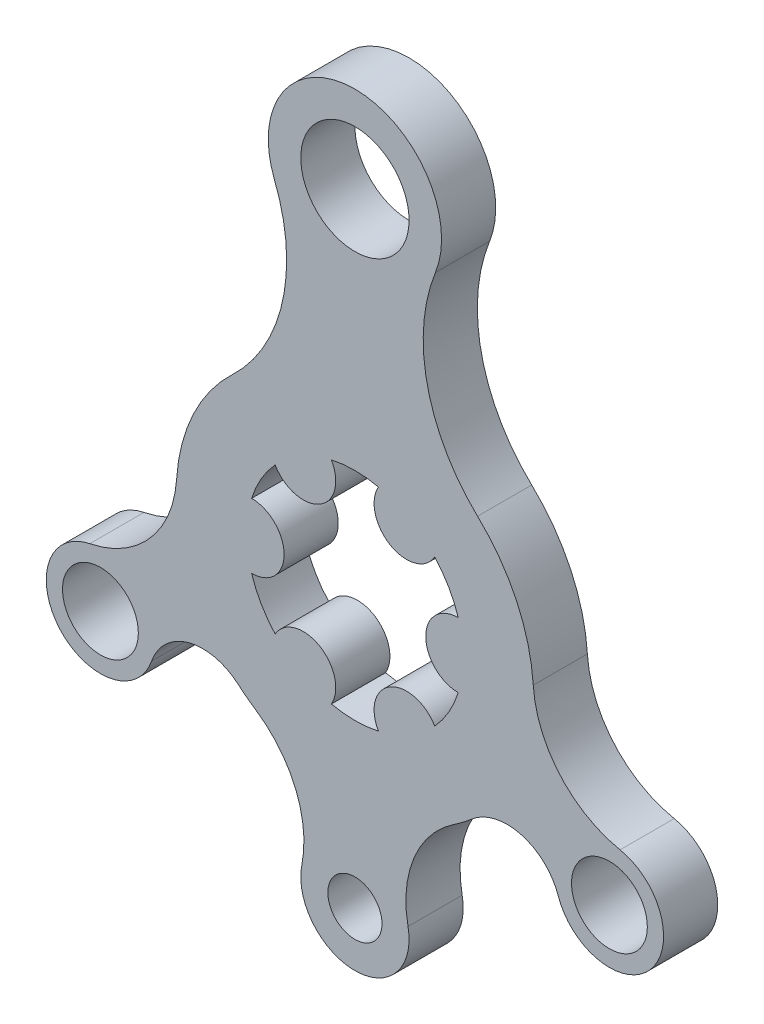
ISO-10303-21;
HEADER;
FILE_DESCRIPTION(('STEP AP214'),'2;1');
FILE_NAME('part.step','',(''),(''),'','','');
FILE_SCHEMA(('AUTOMOTIVE_DESIGN { 1 0 10303 214 1 1 1 1 }'));
ENDSEC;
DATA;
#1=APPLICATION_CONTEXT('core data for automotive mechanical design processes');
#2=APPLICATION_PROTOCOL_DEFINITION('international standard','automotive_design',2000,#1);
#3=PRODUCT_CONTEXT('',#1,'mechanical');
#4=PRODUCT('Part','Part','',(#3));
#5=PRODUCT_RELATED_PRODUCT_CATEGORY('part','',(#4));
#6=PRODUCT_DEFINITION_FORMATION('','',#4);
#7=PRODUCT_DEFINITION_CONTEXT('part definition',#1,'design');
#8=PRODUCT_DEFINITION('design','',#6,#7);
#9=PRODUCT_DEFINITION_SHAPE('','',#8);
#10=(LENGTH_UNIT() NAMED_UNIT(*) SI_UNIT(.MILLI.,.METRE.));
#11=(NAMED_UNIT(*) PLANE_ANGLE_UNIT() SI_UNIT($,.RADIAN.));
#12=(NAMED_UNIT(*) SI_UNIT($,.STERADIAN.) SOLID_ANGLE_UNIT());
#13=UNCERTAINTY_MEASURE_WITH_UNIT(LENGTH_MEASURE(1.E-05),#10,'distance_accuracy_value','');
#14=(GEOMETRIC_REPRESENTATION_CONTEXT(3) GLOBAL_UNCERTAINTY_ASSIGNED_CONTEXT((#13)) GLOBAL_UNIT_ASSIGNED_CONTEXT((#10,
#11,#12)) REPRESENTATION_CONTEXT('',''));
#15=CARTESIAN_POINT('',(0.,0.,0.));
#16=DIRECTION('',(0.,0.,1.));
#17=DIRECTION('',(1.,0.,0.));
#18=AXIS2_PLACEMENT_3D('',#15,#16,#17);
#19=CARTESIAN_POINT('',(0.,0.,10.));
#20=DIRECTION('',(0.,0.,-1.));
#21=DIRECTION('',(-1.,0.,0.));
#22=AXIS2_PLACEMENT_3D('',#19,#20,#21);
#23=CYLINDRICAL_SURFACE('',#22,20.);
#24=CARTESIAN_POINT('',(0.,0.,0.));
#25=DIRECTION('',(0.,0.,1.));
#26=DIRECTION('',(1.,0.,0.));
#27=AXIS2_PLACEMENT_3D('',#24,#25,#26);
#28=CIRCLE('',#27,20.);
#29=CARTESIAN_POINT('',(14.7355444368761,-13.5227116418583,0.));
#30=VERTEX_POINT('',#29);
#31=CARTESIAN_POINT('',(19.0787840283389,-6.,0.));
#32=VERTEX_POINT('',#31);
#33=EDGE_CURVE('E316',#30,#32,#28,.T.);
#34=ORIENTED_EDGE('',*,*,#33,.F.);
#35=DIRECTION('',(0.,0.,-1.));
#36=VECTOR('',#35,1.);
#37=CARTESIAN_POINT('',(14.7355444368761,-13.5227116418583,10.));
#38=LINE('',#37,#36);
#39=CARTESIAN_POINT('',(14.7355444368761,-13.5227116418583,10.));
#40=VERTEX_POINT('',#39);
#41=EDGE_CURVE('E11',#40,#30,#38,.T.);
#42=ORIENTED_EDGE('',*,*,#41,.F.);
#43=CARTESIAN_POINT('',(0.,0.,10.));
#44=DIRECTION('',(0.,0.,1.));
#45=DIRECTION('',(1.,0.,0.));
#46=AXIS2_PLACEMENT_3D('',#43,#44,#45);
#47=CIRCLE('',#46,20.);
#48=CARTESIAN_POINT('',(19.0787840283389,-6.,10.));
#49=VERTEX_POINT('',#48);
#50=EDGE_CURVE('E518',#40,#49,#47,.T.);
#51=ORIENTED_EDGE('',*,*,#50,.T.);
#52=DIRECTION('',(0.,0.,-1.));
#53=VECTOR('',#52,1.);
#54=CARTESIAN_POINT('',(19.0787840283389,-6.,10.));
#55=LINE('',#54,#53);
#56=EDGE_CURVE('E152',#49,#32,#55,.T.);
#57=ORIENTED_EDGE('',*,*,#56,.T.);
#58=EDGE_LOOP('',(#34,#42,#51,#57));
#59=FACE_BOUND('',#58,.T.);
#60=ADVANCED_FACE('F39',(#59),#23,.F.);
#61=CARTESIAN_POINT('',(9.53939201416947,-16.5227116418583,10.));
#62=DIRECTION('',(0.,0.,-1.));
#63=DIRECTION('',(-1.,0.,0.));
#64=AXIS2_PLACEMENT_3D('',#61,#62,#63);
#65=CYLINDRICAL_SURFACE('',#64,6.);
#66=CARTESIAN_POINT('',(9.53939201416947,-16.5227116418583,0.));
#67=DIRECTION('',(0.,0.,1.));
#68=DIRECTION('',(1.,0.,0.));
#69=AXIS2_PLACEMENT_3D('',#66,#67,#68);
#70=CIRCLE('',#69,6.);
#71=CARTESIAN_POINT('',(4.34323959146283,-19.5227116418583,0.));
#72=VERTEX_POINT('',#71);
#73=EDGE_CURVE('E319',#30,#72,#70,.T.);
#74=ORIENTED_EDGE('',*,*,#73,.T.);
#75=DIRECTION('',(0.,0.,-1.));
#76=VECTOR('',#75,1.);
#77=CARTESIAN_POINT('',(4.34323959146283,-19.5227116418583,10.));
#78=LINE('',#77,#76);
#79=CARTESIAN_POINT('',(4.34323959146283,-19.5227116418583,10.));
#80=VERTEX_POINT('',#79);
#81=EDGE_CURVE('E49',#80,#72,#78,.T.);
#82=ORIENTED_EDGE('',*,*,#81,.F.);
#83=CARTESIAN_POINT('',(9.53939201416947,-16.5227116418583,10.));
#84=DIRECTION('',(0.,0.,1.));
#85=DIRECTION('',(1.,0.,0.));
#86=AXIS2_PLACEMENT_3D('',#83,#84,#85);
#87=CIRCLE('',#86,6.);
#88=EDGE_CURVE('E520',#40,#80,#87,.T.);
#89=ORIENTED_EDGE('',*,*,#88,.F.);
#90=ORIENTED_EDGE('',*,*,#41,.T.);
#91=EDGE_LOOP('',(#74,#82,#89,#90));
#92=FACE_BOUND('',#91,.T.);
#93=ADVANCED_FACE('F549',(#92),#65,.T.);
#94=CARTESIAN_POINT('',(0.,0.,10.));
#95=DIRECTION('',(0.,0.,-1.));
#96=DIRECTION('',(-1.,0.,0.));
#97=AXIS2_PLACEMENT_3D('',#94,#95,#96);
#98=CYLINDRICAL_SURFACE('',#97,20.);
#99=CARTESIAN_POINT('',(0.,0.,0.));
#100=DIRECTION('',(0.,0.,1.));
#101=DIRECTION('',(1.,0.,0.));
#102=AXIS2_PLACEMENT_3D('',#99,#100,#101);
#103=CIRCLE('',#102,20.);
#104=CARTESIAN_POINT('',(-4.34323959146281,-19.5227116418583,0.));
#105=VERTEX_POINT('',#104);
#106=EDGE_CURVE('E322',#105,#72,#103,.T.);
#107=ORIENTED_EDGE('',*,*,#106,.F.);
#108=DIRECTION('',(0.,0.,-1.));
#109=VECTOR('',#108,1.);
#110=CARTESIAN_POINT('',(-4.34323959146281,-19.5227116418583,10.));
#111=LINE('',#110,#109);
#112=CARTESIAN_POINT('',(-4.34323959146281,-19.5227116418583,10.));
#113=VERTEX_POINT('',#112);
#114=EDGE_CURVE('E365',#113,#105,#111,.T.);
#115=ORIENTED_EDGE('',*,*,#114,.F.);
#116=CARTESIAN_POINT('',(0.,0.,10.));
#117=DIRECTION('',(0.,0.,1.));
#118=DIRECTION('',(1.,0.,0.));
#119=AXIS2_PLACEMENT_3D('',#116,#117,#118);
#120=CIRCLE('',#119,20.);
#121=EDGE_CURVE('E522',#113,#80,#120,.T.);
#122=ORIENTED_EDGE('',*,*,#121,.T.);
#123=ORIENTED_EDGE('',*,*,#81,.T.);
#124=EDGE_LOOP('',(#107,#115,#122,#123));
#125=FACE_BOUND('',#124,.T.);
#126=ADVANCED_FACE('F552',(#125),#98,.F.);
#127=CARTESIAN_POINT('',(-9.53939201416945,-16.5227116418583,10.));
#128=DIRECTION('',(0.,0.,-1.));
#129=DIRECTION('',(-1.,0.,0.));
#130=AXIS2_PLACEMENT_3D('',#127,#128,#129);
#131=CYLINDRICAL_SURFACE('',#130,6.);
#132=CARTESIAN_POINT('',(-9.53939201416945,-16.5227116418583,0.));
#133=DIRECTION('',(0.,0.,1.));
#134=DIRECTION('',(1.,0.,0.));
#135=AXIS2_PLACEMENT_3D('',#132,#133,#134);
#136=CIRCLE('',#135,6.);
#137=CARTESIAN_POINT('',(-14.7355444368761,-13.5227116418583,0.));
#138=VERTEX_POINT('',#137);
#139=EDGE_CURVE('E325',#105,#138,#136,.T.);
#140=ORIENTED_EDGE('',*,*,#139,.T.);
#141=DIRECTION('',(0.,0.,-1.));
#142=VECTOR('',#141,1.);
#143=CARTESIAN_POINT('',(-14.7355444368761,-13.5227116418583,10.));
#144=LINE('',#143,#142);
#145=CARTESIAN_POINT('',(-14.7355444368761,-13.5227116418583,10.));
#146=VERTEX_POINT('',#145);
#147=EDGE_CURVE('E363',#146,#138,#144,.T.);
#148=ORIENTED_EDGE('',*,*,#147,.F.);
#149=CARTESIAN_POINT('',(-9.53939201416945,-16.5227116418583,10.));
#150=DIRECTION('',(0.,0.,1.));
#151=DIRECTION('',(1.,0.,0.));
#152=AXIS2_PLACEMENT_3D('',#149,#150,#151);
#153=CIRCLE('',#152,6.);
#154=EDGE_CURVE('E525',#113,#146,#153,.T.);
#155=ORIENTED_EDGE('',*,*,#154,.F.);
#156=ORIENTED_EDGE('',*,*,#114,.T.);
#157=EDGE_LOOP('',(#140,#148,#155,#156));
#158=FACE_BOUND('',#157,.T.);
#159=ADVANCED_FACE('F557',(#158),#131,.T.);
#160=CARTESIAN_POINT('',(0.,0.,10.));
#161=DIRECTION('',(0.,0.,-1.));
#162=DIRECTION('',(-1.,0.,0.));
#163=AXIS2_PLACEMENT_3D('',#160,#161,#162);
#164=CYLINDRICAL_SURFACE('',#163,20.);
#165=CARTESIAN_POINT('',(0.,0.,0.));
#166=DIRECTION('',(0.,0.,1.));
#167=DIRECTION('',(1.,0.,0.));
#168=AXIS2_PLACEMENT_3D('',#165,#166,#167);
#169=CIRCLE('',#168,20.);
#170=CARTESIAN_POINT('',(-19.0787840283389,-5.99999999999999,0.));
#171=VERTEX_POINT('',#170);
#172=EDGE_CURVE('E328',#171,#138,#169,.T.);
#173=ORIENTED_EDGE('',*,*,#172,.F.);
#174=DIRECTION('',(0.,0.,-1.));
#175=VECTOR('',#174,1.);
#176=CARTESIAN_POINT('',(-19.0787840283389,-5.99999999999999,10.));
#177=LINE('',#176,#175);
#178=CARTESIAN_POINT('',(-19.0787840283389,-5.99999999999999,10.));
#179=VERTEX_POINT('',#178);
#180=EDGE_CURVE('E361',#179,#171,#177,.T.);
#181=ORIENTED_EDGE('',*,*,#180,.F.);
#182=CARTESIAN_POINT('',(0.,0.,10.));
#183=DIRECTION('',(0.,0.,1.));
#184=DIRECTION('',(1.,0.,0.));
#185=AXIS2_PLACEMENT_3D('',#182,#183,#184);
#186=CIRCLE('',#185,20.);
#187=EDGE_CURVE('E527',#179,#146,#186,.T.);
#188=ORIENTED_EDGE('',*,*,#187,.T.);
#189=ORIENTED_EDGE('',*,*,#147,.T.);
#190=EDGE_LOOP('',(#173,#181,#188,#189));
#191=FACE_BOUND('',#190,.T.);
#192=ADVANCED_FACE('F564',(#191),#164,.F.);
#193=CARTESIAN_POINT('',(-19.0787840283389,0.,10.));
#194=DIRECTION('',(0.,0.,-1.));
#195=DIRECTION('',(-1.,0.,0.));
#196=AXIS2_PLACEMENT_3D('',#193,#194,#195);
#197=CYLINDRICAL_SURFACE('',#196,6.);
#198=CARTESIAN_POINT('',(-19.0787840283389,0.,0.));
#199=DIRECTION('',(0.,0.,1.));
#200=DIRECTION('',(1.,0.,0.));
#201=AXIS2_PLACEMENT_3D('',#198,#199,#200);
#202=CIRCLE('',#201,6.);
#203=CARTESIAN_POINT('',(-19.0787840283389,6.,0.));
#204=VERTEX_POINT('',#203);
#205=EDGE_CURVE('E331',#171,#204,#202,.T.);
#206=ORIENTED_EDGE('',*,*,#205,.T.);
#207=DIRECTION('',(0.,0.,-1.));
#208=VECTOR('',#207,1.);
#209=CARTESIAN_POINT('',(-19.0787840283389,6.,10.));
#210=LINE('',#209,#208);
#211=CARTESIAN_POINT('',(-19.0787840283389,6.,10.));
#212=VERTEX_POINT('',#211);
#213=EDGE_CURVE('E359',#212,#204,#210,.T.);
#214=ORIENTED_EDGE('',*,*,#213,.F.);
#215=CARTESIAN_POINT('',(-19.0787840283389,0.,10.));
#216=DIRECTION('',(0.,0.,1.));
#217=DIRECTION('',(1.,0.,0.));
#218=AXIS2_PLACEMENT_3D('',#215,#216,#217);
#219=CIRCLE('',#218,6.);
#220=EDGE_CURVE('E530',#179,#212,#219,.T.);
#221=ORIENTED_EDGE('',*,*,#220,.F.);
#222=ORIENTED_EDGE('',*,*,#180,.T.);
#223=EDGE_LOOP('',(#206,#214,#221,#222));
#224=FACE_BOUND('',#223,.T.);
#225=ADVANCED_FACE('F567',(#224),#197,.T.);
#226=CARTESIAN_POINT('',(0.,0.,10.));
#227=DIRECTION('',(0.,0.,-1.));
#228=DIRECTION('',(-1.,0.,0.));
#229=AXIS2_PLACEMENT_3D('',#226,#227,#228);
#230=CYLINDRICAL_SURFACE('',#229,20.);
#231=CARTESIAN_POINT('',(0.,0.,0.));
#232=DIRECTION('',(0.,0.,1.));
#233=DIRECTION('',(1.,0.,0.));
#234=AXIS2_PLACEMENT_3D('',#231,#232,#233);
#235=CIRCLE('',#234,20.);
#236=CARTESIAN_POINT('',(-14.7355444368761,13.5227116418583,0.));
#237=VERTEX_POINT('',#236);
#238=EDGE_CURVE('E334',#237,#204,#235,.T.);
#239=ORIENTED_EDGE('',*,*,#238,.F.);
#240=DIRECTION('',(0.,0.,-1.));
#241=VECTOR('',#240,1.);
#242=CARTESIAN_POINT('',(-14.7355444368761,13.5227116418583,10.));
#243=LINE('',#242,#241);
#244=CARTESIAN_POINT('',(-14.7355444368761,13.5227116418583,10.));
#245=VERTEX_POINT('',#244);
#246=EDGE_CURVE('E357',#245,#237,#243,.T.);
#247=ORIENTED_EDGE('',*,*,#246,.F.);
#248=CARTESIAN_POINT('',(0.,0.,10.));
#249=DIRECTION('',(0.,0.,1.));
#250=DIRECTION('',(1.,0.,0.));
#251=AXIS2_PLACEMENT_3D('',#248,#249,#250);
#252=CIRCLE('',#251,20.);
#253=EDGE_CURVE('E532',#245,#212,#252,.T.);
#254=ORIENTED_EDGE('',*,*,#253,.T.);
#255=ORIENTED_EDGE('',*,*,#213,.T.);
#256=EDGE_LOOP('',(#239,#247,#254,#255));
#257=FACE_BOUND('',#256,.T.);
#258=ADVANCED_FACE('F570',(#257),#230,.F.);
#259=CARTESIAN_POINT('',(-9.53939201416946,16.5227116418583,10.));
#260=DIRECTION('',(0.,0.,-1.));
#261=DIRECTION('',(-1.,0.,0.));
#262=AXIS2_PLACEMENT_3D('',#259,#260,#261);
#263=CYLINDRICAL_SURFACE('',#262,6.);
#264=CARTESIAN_POINT('',(-9.53939201416946,16.5227116418583,0.));
#265=DIRECTION('',(0.,0.,1.));
#266=DIRECTION('',(1.,0.,0.));
#267=AXIS2_PLACEMENT_3D('',#264,#265,#266);
#268=CIRCLE('',#267,6.);
#269=CARTESIAN_POINT('',(-4.34323959146283,19.5227116418583,0.));
#270=VERTEX_POINT('',#269);
#271=EDGE_CURVE('E337',#237,#270,#268,.T.);
#272=ORIENTED_EDGE('',*,*,#271,.T.);
#273=DIRECTION('',(0.,0.,-1.));
#274=VECTOR('',#273,1.);
#275=CARTESIAN_POINT('',(-4.34323959146283,19.5227116418583,10.));
#276=LINE('',#275,#274);
#277=CARTESIAN_POINT('',(-4.34323959146283,19.5227116418583,10.));
#278=VERTEX_POINT('',#277);
#279=EDGE_CURVE('E355',#278,#270,#276,.T.);
#280=ORIENTED_EDGE('',*,*,#279,.F.);
#281=CARTESIAN_POINT('',(-9.53939201416946,16.5227116418583,10.));
#282=DIRECTION('',(0.,0.,1.));
#283=DIRECTION('',(1.,0.,0.));
#284=AXIS2_PLACEMENT_3D('',#281,#282,#283);
#285=CIRCLE('',#284,6.);
#286=EDGE_CURVE('E535',#245,#278,#285,.T.);
#287=ORIENTED_EDGE('',*,*,#286,.F.);
#288=ORIENTED_EDGE('',*,*,#246,.T.);
#289=EDGE_LOOP('',(#272,#280,#287,#288));
#290=FACE_BOUND('',#289,.T.);
#291=ADVANCED_FACE('F573',(#290),#263,.T.);
#292=CARTESIAN_POINT('',(0.,0.,10.));
#293=DIRECTION('',(0.,0.,-1.));
#294=DIRECTION('',(-1.,0.,0.));
#295=AXIS2_PLACEMENT_3D('',#292,#293,#294);
#296=CYLINDRICAL_SURFACE('',#295,20.);
#297=CARTESIAN_POINT('',(0.,0.,0.));
#298=DIRECTION('',(0.,0.,1.));
#299=DIRECTION('',(1.,0.,0.));
#300=AXIS2_PLACEMENT_3D('',#297,#298,#299);
#301=CIRCLE('',#300,20.);
#302=CARTESIAN_POINT('',(4.34323959146282,19.5227116418583,0.));
#303=VERTEX_POINT('',#302);
#304=EDGE_CURVE('E340',#303,#270,#301,.T.);
#305=ORIENTED_EDGE('',*,*,#304,.F.);
#306=DIRECTION('',(0.,0.,-1.));
#307=VECTOR('',#306,1.);
#308=CARTESIAN_POINT('',(4.34323959146282,19.5227116418583,10.));
#309=LINE('',#308,#307);
#310=CARTESIAN_POINT('',(4.34323959146282,19.5227116418583,10.));
#311=VERTEX_POINT('',#310);
#312=EDGE_CURVE('E253',#311,#303,#309,.T.);
#313=ORIENTED_EDGE('',*,*,#312,.F.);
#314=CARTESIAN_POINT('',(0.,0.,10.));
#315=DIRECTION('',(0.,0.,1.));
#316=DIRECTION('',(1.,0.,0.));
#317=AXIS2_PLACEMENT_3D('',#314,#315,#316);
#318=CIRCLE('',#317,20.);
#319=EDGE_CURVE('E242',#311,#278,#318,.T.);
#320=ORIENTED_EDGE('',*,*,#319,.T.);
#321=ORIENTED_EDGE('',*,*,#279,.T.);
#322=EDGE_LOOP('',(#305,#313,#320,#321));
#323=FACE_BOUND('',#322,.T.);
#324=ADVANCED_FACE('F538',(#323),#296,.F.);
#325=CARTESIAN_POINT('',(9.53939201416945,16.5227116418583,10.));
#326=DIRECTION('',(0.,0.,-1.));
#327=DIRECTION('',(-1.,0.,0.));
#328=AXIS2_PLACEMENT_3D('',#325,#326,#327);
#329=CYLINDRICAL_SURFACE('',#328,6.);
#330=CARTESIAN_POINT('',(9.53939201416945,16.5227116418583,0.));
#331=DIRECTION('',(0.,0.,1.));
#332=DIRECTION('',(1.,0.,0.));
#333=AXIS2_PLACEMENT_3D('',#330,#331,#332);
#334=CIRCLE('',#333,6.);
#335=CARTESIAN_POINT('',(14.7355444368761,13.5227116418583,0.));
#336=VERTEX_POINT('',#335);
#337=EDGE_CURVE('E249',#303,#336,#334,.T.);
#338=ORIENTED_EDGE('',*,*,#337,.T.);
#339=DIRECTION('',(0.,0.,-1.));
#340=VECTOR('',#339,1.);
#341=CARTESIAN_POINT('',(14.7355444368761,13.5227116418583,10.));
#342=LINE('',#341,#340);
#343=CARTESIAN_POINT('',(14.7355444368761,13.5227116418583,10.));
#344=VERTEX_POINT('',#343);
#345=EDGE_CURVE('E246',#344,#336,#342,.T.);
#346=ORIENTED_EDGE('',*,*,#345,.F.);
#347=CARTESIAN_POINT('',(9.53939201416945,16.5227116418583,10.));
#348=DIRECTION('',(0.,0.,1.));
#349=DIRECTION('',(1.,0.,0.));
#350=AXIS2_PLACEMENT_3D('',#347,#348,#349);
#351=CIRCLE('',#350,6.);
#352=EDGE_CURVE('E235',#311,#344,#351,.T.);
#353=ORIENTED_EDGE('',*,*,#352,.F.);
#354=ORIENTED_EDGE('',*,*,#312,.T.);
#355=EDGE_LOOP('',(#338,#346,#353,#354));
#356=FACE_BOUND('',#355,.T.);
#357=ADVANCED_FACE('F247',(#356),#329,.T.);
#358=CARTESIAN_POINT('',(0.,0.,10.));
#359=DIRECTION('',(0.,0.,-1.));
#360=DIRECTION('',(-1.,0.,0.));
#361=AXIS2_PLACEMENT_3D('',#358,#359,#360);
#362=CYLINDRICAL_SURFACE('',#361,20.);
#363=CARTESIAN_POINT('',(0.,0.,0.));
#364=DIRECTION('',(0.,0.,1.));
#365=DIRECTION('',(1.,0.,0.));
#366=AXIS2_PLACEMENT_3D('',#363,#364,#365);
#367=CIRCLE('',#366,20.);
#368=CARTESIAN_POINT('',(19.0787840283389,6.,0.));
#369=VERTEX_POINT('',#368);
#370=EDGE_CURVE('E344',#369,#336,#367,.T.);
#371=ORIENTED_EDGE('',*,*,#370,.F.);
#372=DIRECTION('',(0.,0.,-1.));
#373=VECTOR('',#372,1.);
#374=CARTESIAN_POINT('',(19.0787840283389,6.,10.));
#375=LINE('',#374,#373);
#376=CARTESIAN_POINT('',(19.0787840283389,6.,10.));
#377=VERTEX_POINT('',#376);
#378=EDGE_CURVE('E145',#377,#369,#375,.T.);
#379=ORIENTED_EDGE('',*,*,#378,.F.);
#380=CARTESIAN_POINT('',(0.,0.,10.));
#381=DIRECTION('',(0.,0.,1.));
#382=DIRECTION('',(1.,0.,0.));
#383=AXIS2_PLACEMENT_3D('',#380,#381,#382);
#384=CIRCLE('',#383,20.);
#385=EDGE_CURVE('E240',#377,#344,#384,.T.);
#386=ORIENTED_EDGE('',*,*,#385,.T.);
#387=ORIENTED_EDGE('',*,*,#345,.T.);
#388=EDGE_LOOP('',(#371,#379,#386,#387));
#389=FACE_BOUND('',#388,.T.);
#390=ADVANCED_FACE('F255',(#389),#362,.F.);
#391=CARTESIAN_POINT('',(52.8897897671533,3.41615842523861,10.));
#392=DIRECTION('',(0.,0.,-1.));
#393=DIRECTION('',(-1.,0.,0.));
#394=AXIS2_PLACEMENT_3D('',#391,#392,#393);
#395=CYLINDRICAL_SURFACE('',#394,20.);
#396=CARTESIAN_POINT('',(52.8897897671533,3.41615842523861,0.));
#397=DIRECTION('',(0.,0.,1.));
#398=DIRECTION('',(1.,0.,0.));
#399=AXIS2_PLACEMENT_3D('',#396,#397,#398);
#400=CIRCLE('',#399,20.);
#401=CARTESIAN_POINT('',(48.9632632557178,-16.1946138582538,0.));
#402=VERTEX_POINT('',#401);
#403=CARTESIAN_POINT('',(32.9313785342653,2.12704203835612,0.));
#404=VERTEX_POINT('',#403);
#405=EDGE_CURVE('E264',#402,#404,#400,.F.);
#406=ORIENTED_EDGE('',*,*,#405,.T.);
#407=DIRECTION('',(0.,0.,-1.));
#408=VECTOR('',#407,1.);
#409=CARTESIAN_POINT('',(32.9313785342653,2.12704203835612,10.));
#410=LINE('',#409,#408);
#411=CARTESIAN_POINT('',(32.9313785342653,2.12704203835612,10.));
#412=VERTEX_POINT('',#411);
#413=EDGE_CURVE('E43',#412,#404,#410,.T.);
#414=ORIENTED_EDGE('',*,*,#413,.F.);
#415=CARTESIAN_POINT('',(52.8897897671533,3.41615842523861,10.));
#416=DIRECTION('',(0.,0.,1.));
#417=DIRECTION('',(1.,0.,0.));
#418=AXIS2_PLACEMENT_3D('',#415,#416,#417);
#419=CIRCLE('',#418,20.);
#420=CARTESIAN_POINT('',(48.9632632557178,-16.1946138582538,10.));
#421=VERTEX_POINT('',#420);
#422=EDGE_CURVE('E351',#421,#412,#419,.F.);
#423=ORIENTED_EDGE('',*,*,#422,.F.);
#424=DIRECTION('',(0.,0.,-1.));
#425=VECTOR('',#424,1.);
#426=CARTESIAN_POINT('',(48.9632632557178,-16.1946138582538,10.));
#427=LINE('',#426,#425);
#428=EDGE_CURVE('E263',#421,#402,#427,.T.);
#429=ORIENTED_EDGE('',*,*,#428,.T.);
#430=EDGE_LOOP('',(#406,#414,#423,#429));
#431=FACE_BOUND('',#430,.T.);
#432=ADVANCED_FACE('F41',(#431),#395,.F.);
#433=CARTESIAN_POINT('',(0.,0.,10.));
#434=DIRECTION('',(0.,0.,-1.));
#435=DIRECTION('',(-1.,0.,0.));
#436=AXIS2_PLACEMENT_3D('',#433,#434,#435);
#437=CYLINDRICAL_SURFACE('',#436,33.);
#438=CARTESIAN_POINT('',(0.,0.,0.));
#439=DIRECTION('',(0.,0.,1.));
#440=DIRECTION('',(1.,0.,0.));
#441=AXIS2_PLACEMENT_3D('',#438,#439,#440);
#442=CIRCLE('',#441,33.);
#443=CARTESIAN_POINT('',(22.6472459019112,24.0021301775148,0.));
#444=VERTEX_POINT('',#443);
#445=EDGE_CURVE('E267',#404,#444,#442,.T.);
#446=ORIENTED_EDGE('',*,*,#445,.T.);
#447=DIRECTION('',(0.,0.,-1.));
#448=VECTOR('',#447,1.);
#449=CARTESIAN_POINT('',(22.6472459019112,24.0021301775148,10.));
#450=LINE('',#449,#448);
#451=CARTESIAN_POINT('',(22.6472459019112,24.0021301775148,10.));
#452=VERTEX_POINT('',#451);
#453=EDGE_CURVE('E398',#452,#444,#450,.T.);
#454=ORIENTED_EDGE('',*,*,#453,.F.);
#455=CARTESIAN_POINT('',(0.,0.,10.));
#456=DIRECTION('',(0.,0.,1.));
#457=DIRECTION('',(1.,0.,0.));
#458=AXIS2_PLACEMENT_3D('',#455,#456,#457);
#459=CIRCLE('',#458,33.);
#460=EDGE_CURVE('E160',#412,#452,#459,.T.);
#461=ORIENTED_EDGE('',*,*,#460,.F.);
#462=ORIENTED_EDGE('',*,*,#413,.T.);
#463=EDGE_LOOP('',(#446,#454,#461,#462));
#464=FACE_BOUND('',#463,.T.);
#465=ADVANCED_FACE('F404',(#464),#437,.T.);
#466=CARTESIAN_POINT('',(44.6082116249766,47.2769230769231,10.));
#467=DIRECTION('',(0.,0.,-1.));
#468=DIRECTION('',(-1.,0.,0.));
#469=AXIS2_PLACEMENT_3D('',#466,#467,#468);
#470=CYLINDRICAL_SURFACE('',#469,32.);
#471=CARTESIAN_POINT('',(44.6082116249766,47.2769230769231,0.));
#472=DIRECTION('',(0.,0.,1.));
#473=DIRECTION('',(1.,0.,0.));
#474=AXIS2_PLACEMENT_3D('',#471,#472,#473);
#475=CIRCLE('',#474,32.);
#476=CARTESIAN_POINT('',(14.8694038749922,59.0923076923077,0.));
#477=VERTEX_POINT('',#476);
#478=EDGE_CURVE('E269',#444,#477,#475,.F.);
#479=ORIENTED_EDGE('',*,*,#478,.T.);
#480=DIRECTION('',(0.,0.,-1.));
#481=VECTOR('',#480,1.);
#482=CARTESIAN_POINT('',(14.8694038749922,59.0923076923077,10.));
#483=LINE('',#482,#481);
#484=CARTESIAN_POINT('',(14.8694038749922,59.0923076923077,10.));
#485=VERTEX_POINT('',#484);
#486=EDGE_CURVE('E396',#485,#477,#483,.T.);
#487=ORIENTED_EDGE('',*,*,#486,.F.);
#488=CARTESIAN_POINT('',(44.6082116249766,47.2769230769231,10.));
#489=DIRECTION('',(0.,0.,1.));
#490=DIRECTION('',(1.,0.,0.));
#491=AXIS2_PLACEMENT_3D('',#488,#489,#490);
#492=CIRCLE('',#491,32.);
#493=EDGE_CURVE('E486',#452,#485,#492,.F.);
#494=ORIENTED_EDGE('',*,*,#493,.F.);
#495=ORIENTED_EDGE('',*,*,#453,.T.);
#496=EDGE_LOOP('',(#479,#487,#494,#495));
#497=FACE_BOUND('',#496,.T.);
#498=ADVANCED_FACE('F485',(#497),#470,.F.);
#499=CARTESIAN_POINT('',(0.,65.,10.));
#500=DIRECTION('',(0.,0.,-1.));
#501=DIRECTION('',(-1.,0.,0.));
#502=AXIS2_PLACEMENT_3D('',#499,#500,#501);
#503=CYLINDRICAL_SURFACE('',#502,16.);
#504=CARTESIAN_POINT('',(0.,65.,0.));
#505=DIRECTION('',(0.,0.,1.));
#506=DIRECTION('',(1.,0.,0.));
#507=AXIS2_PLACEMENT_3D('',#504,#505,#506);
#508=CIRCLE('',#507,16.);
#509=CARTESIAN_POINT('',(-14.8694038749922,59.0923076923077,0.));
#510=VERTEX_POINT('',#509);
#511=EDGE_CURVE('E271',#477,#510,#508,.T.);
#512=ORIENTED_EDGE('',*,*,#511,.T.);
#513=DIRECTION('',(0.,0.,-1.));
#514=VECTOR('',#513,1.);
#515=CARTESIAN_POINT('',(-14.8694038749922,59.0923076923077,10.));
#516=LINE('',#515,#514);
#517=CARTESIAN_POINT('',(-14.8694038749922,59.0923076923077,10.));
#518=VERTEX_POINT('',#517);
#519=EDGE_CURVE('E394',#518,#510,#516,.T.);
#520=ORIENTED_EDGE('',*,*,#519,.F.);
#521=CARTESIAN_POINT('',(0.,65.,10.));
#522=DIRECTION('',(0.,0.,1.));
#523=DIRECTION('',(1.,0.,0.));
#524=AXIS2_PLACEMENT_3D('',#521,#522,#523);
#525=CIRCLE('',#524,16.);
#526=EDGE_CURVE('E487',#485,#518,#525,.T.);
#527=ORIENTED_EDGE('',*,*,#526,.F.);
#528=ORIENTED_EDGE('',*,*,#486,.T.);
#529=EDGE_LOOP('',(#512,#520,#527,#528));
#530=FACE_BOUND('',#529,.T.);
#531=ADVANCED_FACE('F483',(#530),#503,.T.);
#532=CARTESIAN_POINT('',(-44.6082116249766,47.2769230769231,10.));
#533=DIRECTION('',(0.,0.,-1.));
#534=DIRECTION('',(-1.,0.,0.));
#535=AXIS2_PLACEMENT_3D('',#532,#533,#534);
#536=CYLINDRICAL_SURFACE('',#535,32.);
#537=CARTESIAN_POINT('',(-44.6082116249766,47.2769230769231,0.));
#538=DIRECTION('',(0.,0.,1.));
#539=DIRECTION('',(1.,0.,0.));
#540=AXIS2_PLACEMENT_3D('',#537,#538,#539);
#541=CIRCLE('',#540,32.);
#542=CARTESIAN_POINT('',(-22.6472459019112,24.0021301775148,0.));
#543=VERTEX_POINT('',#542);
#544=EDGE_CURVE('E274',#543,#510,#541,.T.);
#545=ORIENTED_EDGE('',*,*,#544,.F.);
#546=DIRECTION('',(0.,0.,-1.));
#547=VECTOR('',#546,1.);
#548=CARTESIAN_POINT('',(-22.6472459019112,24.0021301775148,10.));
#549=LINE('',#548,#547);
#550=CARTESIAN_POINT('',(-22.6472459019112,24.0021301775148,10.));
#551=VERTEX_POINT('',#550);
#552=EDGE_CURVE('E392',#551,#543,#549,.T.);
#553=ORIENTED_EDGE('',*,*,#552,.F.);
#554=CARTESIAN_POINT('',(-44.6082116249766,47.2769230769231,10.));
#555=DIRECTION('',(0.,0.,1.));
#556=DIRECTION('',(1.,0.,0.));
#557=AXIS2_PLACEMENT_3D('',#554,#555,#556);
#558=CIRCLE('',#557,32.);
#559=EDGE_CURVE('E480',#551,#518,#558,.T.);
#560=ORIENTED_EDGE('',*,*,#559,.T.);
#561=ORIENTED_EDGE('',*,*,#519,.T.);
#562=EDGE_LOOP('',(#545,#553,#560,#561));
#563=FACE_BOUND('',#562,.T.);
#564=ADVANCED_FACE('F476',(#563),#536,.F.);
#565=CARTESIAN_POINT('',(0.,0.,10.));
#566=DIRECTION('',(0.,0.,-1.));
#567=DIRECTION('',(-1.,0.,0.));
#568=AXIS2_PLACEMENT_3D('',#565,#566,#567);
#569=CYLINDRICAL_SURFACE('',#568,33.);
#570=CARTESIAN_POINT('',(0.,0.,0.));
#571=DIRECTION('',(0.,0.,1.));
#572=DIRECTION('',(1.,0.,0.));
#573=AXIS2_PLACEMENT_3D('',#570,#571,#572);
#574=CIRCLE('',#573,33.);
#575=CARTESIAN_POINT('',(-32.9313785342652,2.12704203835612,0.));
#576=VERTEX_POINT('',#575);
#577=EDGE_CURVE('E277',#543,#576,#574,.T.);
#578=ORIENTED_EDGE('',*,*,#577,.T.);
#579=DIRECTION('',(0.,0.,-1.));
#580=VECTOR('',#579,1.);
#581=CARTESIAN_POINT('',(-32.9313785342652,2.12704203835612,10.));
#582=LINE('',#581,#580);
#583=CARTESIAN_POINT('',(-32.9313785342652,2.12704203835612,10.));
#584=VERTEX_POINT('',#583);
#585=EDGE_CURVE('E390',#584,#576,#582,.T.);
#586=ORIENTED_EDGE('',*,*,#585,.F.);
#587=CARTESIAN_POINT('',(0.,0.,10.));
#588=DIRECTION('',(0.,0.,1.));
#589=DIRECTION('',(1.,0.,0.));
#590=AXIS2_PLACEMENT_3D('',#587,#588,#589);
#591=CIRCLE('',#590,33.);
#592=EDGE_CURVE('E490',#551,#584,#591,.T.);
#593=ORIENTED_EDGE('',*,*,#592,.F.);
#594=ORIENTED_EDGE('',*,*,#552,.T.);
#595=EDGE_LOOP('',(#578,#586,#593,#594));
#596=FACE_BOUND('',#595,.T.);
#597=ADVANCED_FACE('F472',(#596),#569,.T.);
#598=CARTESIAN_POINT('',(-52.8897897671533,3.41615842523861,10.));
#599=DIRECTION('',(0.,0.,-1.));
#600=DIRECTION('',(-1.,0.,0.));
#601=AXIS2_PLACEMENT_3D('',#598,#599,#600);
#602=CYLINDRICAL_SURFACE('',#601,20.);
#603=CARTESIAN_POINT('',(-52.8897897671533,3.41615842523861,0.));
#604=DIRECTION('',(0.,0.,1.));
#605=DIRECTION('',(1.,0.,0.));
#606=AXIS2_PLACEMENT_3D('',#603,#604,#605);
#607=CIRCLE('',#606,20.);
#608=CARTESIAN_POINT('',(-48.9632632557178,-16.1946138582538,0.));
#609=VERTEX_POINT('',#608);
#610=EDGE_CURVE('E280',#609,#576,#607,.T.);
#611=ORIENTED_EDGE('',*,*,#610,.F.);
#612=DIRECTION('',(0.,0.,-1.));
#613=VECTOR('',#612,1.);
#614=CARTESIAN_POINT('',(-48.9632632557178,-16.1946138582538,10.));
#615=LINE('',#614,#613);
#616=CARTESIAN_POINT('',(-48.9632632557178,-16.1946138582538,10.));
#617=VERTEX_POINT('',#616);
#618=EDGE_CURVE('E388',#617,#609,#615,.T.);
#619=ORIENTED_EDGE('',*,*,#618,.F.);
#620=CARTESIAN_POINT('',(-52.8897897671533,3.41615842523861,10.));
#621=DIRECTION('',(0.,0.,1.));
#622=DIRECTION('',(1.,0.,0.));
#623=AXIS2_PLACEMENT_3D('',#620,#621,#622);
#624=CIRCLE('',#623,20.);
#625=EDGE_CURVE('E469',#617,#584,#624,.T.);
#626=ORIENTED_EDGE('',*,*,#625,.T.);
#627=ORIENTED_EDGE('',*,*,#585,.T.);
#628=EDGE_LOOP('',(#611,#619,#626,#627));
#629=FACE_BOUND('',#628,.T.);
#630=ADVANCED_FACE('F465',(#629),#602,.F.);
#631=CARTESIAN_POINT('',(-47.,-26.,10.));
#632=DIRECTION('',(0.,0.,-1.));
#633=DIRECTION('',(-1.,0.,0.));
#634=AXIS2_PLACEMENT_3D('',#631,#632,#633);
#635=CYLINDRICAL_SURFACE('',#634,10.);
#636=CARTESIAN_POINT('',(-47.,-26.,0.));
#637=DIRECTION('',(0.,0.,1.));
#638=DIRECTION('',(1.,0.,0.));
#639=AXIS2_PLACEMENT_3D('',#636,#637,#638);
#640=CIRCLE('',#639,10.);
#641=CARTESIAN_POINT('',(-37.5509150364807,-29.2733458955926,0.));
#642=VERTEX_POINT('',#641);
#643=EDGE_CURVE('E283',#609,#642,#640,.T.);
#644=ORIENTED_EDGE('',*,*,#643,.T.);
#645=DIRECTION('',(0.,0.,-1.));
#646=VECTOR('',#645,1.);
#647=CARTESIAN_POINT('',(-37.5509150364807,-29.2733458955926,10.));
#648=LINE('',#647,#646);
#649=CARTESIAN_POINT('',(-37.5509150364807,-29.2733458955926,10.));
#650=VERTEX_POINT('',#649);
#651=EDGE_CURVE('E386',#650,#642,#648,.T.);
#652=ORIENTED_EDGE('',*,*,#651,.F.);
#653=CARTESIAN_POINT('',(-47.,-26.,10.));
#654=DIRECTION('',(0.,0.,1.));
#655=DIRECTION('',(1.,0.,0.));
#656=AXIS2_PLACEMENT_3D('',#653,#654,#655);
#657=CIRCLE('',#656,10.);
#658=EDGE_CURVE('E497',#617,#650,#657,.T.);
#659=ORIENTED_EDGE('',*,*,#658,.F.);
#660=ORIENTED_EDGE('',*,*,#618,.T.);
#661=EDGE_LOOP('',(#644,#652,#659,#660));
#662=FACE_BOUND('',#661,.T.);
#663=ADVANCED_FACE('F461',(#662),#635,.T.);
#664=CARTESIAN_POINT('',(-28.1018300729614,-32.5466917911852,10.));
#665=DIRECTION('',(0.,0.,-1.));
#666=DIRECTION('',(-1.,0.,0.));
#667=AXIS2_PLACEMENT_3D('',#664,#665,#666);
#668=CYLINDRICAL_SURFACE('',#667,10.);
#669=CARTESIAN_POINT('',(-28.1018300729614,-32.5466917911852,0.));
#670=DIRECTION('',(0.,0.,1.));
#671=DIRECTION('',(1.,0.,0.));
#672=AXIS2_PLACEMENT_3D('',#669,#670,#671);
#673=CIRCLE('',#672,10.);
#674=CARTESIAN_POINT('',(-21.566520753668,-24.9776937002119,0.));
#675=VERTEX_POINT('',#674);
#676=EDGE_CURVE('E286',#675,#642,#673,.T.);
#677=ORIENTED_EDGE('',*,*,#676,.F.);
#678=DIRECTION('',(0.,0.,-1.));
#679=VECTOR('',#678,1.);
#680=CARTESIAN_POINT('',(-21.566520753668,-24.9776937002119,10.));
#681=LINE('',#680,#679);
#682=CARTESIAN_POINT('',(-21.566520753668,-24.9776937002119,10.));
#683=VERTEX_POINT('',#682);
#684=EDGE_CURVE('E384',#683,#675,#681,.T.);
#685=ORIENTED_EDGE('',*,*,#684,.F.);
#686=CARTESIAN_POINT('',(-28.1018300729614,-32.5466917911852,10.));
#687=DIRECTION('',(0.,0.,1.));
#688=DIRECTION('',(1.,0.,0.));
#689=AXIS2_PLACEMENT_3D('',#686,#687,#688);
#690=CIRCLE('',#689,10.);
#691=EDGE_CURVE('E458',#683,#650,#690,.T.);
#692=ORIENTED_EDGE('',*,*,#691,.T.);
#693=ORIENTED_EDGE('',*,*,#651,.T.);
#694=EDGE_LOOP('',(#677,#685,#692,#693));
#695=FACE_BOUND('',#694,.T.);
#696=ADVANCED_FACE('F454',(#695),#668,.F.);
#697=CARTESIAN_POINT('',(0.,0.,10.));
#698=DIRECTION('',(0.,0.,-1.));
#699=DIRECTION('',(-1.,0.,0.));
#700=AXIS2_PLACEMENT_3D('',#697,#698,#699);
#701=CYLINDRICAL_SURFACE('',#700,33.);
#702=CARTESIAN_POINT('',(0.,0.,0.));
#703=DIRECTION('',(0.,0.,1.));
#704=DIRECTION('',(1.,0.,0.));
#705=AXIS2_PLACEMENT_3D('',#702,#703,#704);
#706=CIRCLE('',#705,33.);
#707=CARTESIAN_POINT('',(-18.3131972355137,-27.4522641509434,0.));
#708=VERTEX_POINT('',#707);
#709=EDGE_CURVE('E289',#675,#708,#706,.T.);
#710=ORIENTED_EDGE('',*,*,#709,.T.);
#711=DIRECTION('',(0.,0.,-1.));
#712=VECTOR('',#711,1.);
#713=CARTESIAN_POINT('',(-18.3131972355137,-27.4522641509434,10.));
#714=LINE('',#713,#712);
#715=CARTESIAN_POINT('',(-18.3131972355137,-27.4522641509434,10.));
#716=VERTEX_POINT('',#715);
#717=EDGE_CURVE('E382',#716,#708,#714,.T.);
#718=ORIENTED_EDGE('',*,*,#717,.F.);
#719=CARTESIAN_POINT('',(0.,0.,10.));
#720=DIRECTION('',(0.,0.,1.));
#721=DIRECTION('',(1.,0.,0.));
#722=AXIS2_PLACEMENT_3D('',#719,#720,#721);
#723=CIRCLE('',#722,33.);
#724=EDGE_CURVE('E500',#683,#716,#723,.T.);
#725=ORIENTED_EDGE('',*,*,#724,.F.);
#726=ORIENTED_EDGE('',*,*,#684,.T.);
#727=EDGE_LOOP('',(#710,#718,#725,#726));
#728=FACE_BOUND('',#727,.T.);
#729=ADVANCED_FACE('F450',(#728),#701,.T.);
#730=CARTESIAN_POINT('',(-29.4121046509766,-44.09,10.));
#731=DIRECTION('',(0.,0.,-1.));
#732=DIRECTION('',(-1.,0.,0.));
#733=AXIS2_PLACEMENT_3D('',#730,#731,#732);
#734=CYLINDRICAL_SURFACE('',#733,20.);
#735=CARTESIAN_POINT('',(-29.4121046509766,-44.09,0.));
#736=DIRECTION('',(0.,0.,1.));
#737=DIRECTION('',(1.,0.,0.));
#738=AXIS2_PLACEMENT_3D('',#735,#736,#737);
#739=CIRCLE('',#738,20.);
#740=CARTESIAN_POINT('',(-9.80403488365886,-48.03,0.));
#741=VERTEX_POINT('',#740);
#742=EDGE_CURVE('E292',#741,#708,#739,.T.);
#743=ORIENTED_EDGE('',*,*,#742,.F.);
#744=DIRECTION('',(0.,0.,-1.));
#745=VECTOR('',#744,1.);
#746=CARTESIAN_POINT('',(-9.80403488365886,-48.03,10.));
#747=LINE('',#746,#745);
#748=CARTESIAN_POINT('',(-9.80403488365886,-48.03,10.));
#749=VERTEX_POINT('',#748);
#750=EDGE_CURVE('E380',#749,#741,#747,.T.);
#751=ORIENTED_EDGE('',*,*,#750,.F.);
#752=CARTESIAN_POINT('',(-29.4121046509766,-44.09,10.));
#753=DIRECTION('',(0.,0.,1.));
#754=DIRECTION('',(1.,0.,0.));
#755=AXIS2_PLACEMENT_3D('',#752,#753,#754);
#756=CIRCLE('',#755,20.);
#757=EDGE_CURVE('E447',#749,#716,#756,.T.);
#758=ORIENTED_EDGE('',*,*,#757,.T.);
#759=ORIENTED_EDGE('',*,*,#717,.T.);
#760=EDGE_LOOP('',(#743,#751,#758,#759));
#761=FACE_BOUND('',#760,.T.);
#762=ADVANCED_FACE('F444',(#761),#734,.F.);
#763=CARTESIAN_POINT('',(0.,-50.,10.));
#764=DIRECTION('',(0.,0.,-1.));
#765=DIRECTION('',(-1.,0.,0.));
#766=AXIS2_PLACEMENT_3D('',#763,#764,#765);
#767=CYLINDRICAL_SURFACE('',#766,9.99999999999999);
#768=CARTESIAN_POINT('',(0.,-50.,0.));
#769=DIRECTION('',(0.,0.,1.));
#770=DIRECTION('',(1.,0.,0.));
#771=AXIS2_PLACEMENT_3D('',#768,#769,#770);
#772=CIRCLE('',#771,9.99999999999999);
#773=CARTESIAN_POINT('',(9.80403488365886,-48.03,0.));
#774=VERTEX_POINT('',#773);
#775=EDGE_CURVE('E295',#741,#774,#772,.T.);
#776=ORIENTED_EDGE('',*,*,#775,.T.);
#777=DIRECTION('',(0.,0.,-1.));
#778=VECTOR('',#777,1.);
#779=CARTESIAN_POINT('',(9.80403488365886,-48.03,10.));
#780=LINE('',#779,#778);
#781=CARTESIAN_POINT('',(9.80403488365886,-48.03,10.));
#782=VERTEX_POINT('',#781);
#783=EDGE_CURVE('E377',#782,#774,#780,.T.);
#784=ORIENTED_EDGE('',*,*,#783,.F.);
#785=CARTESIAN_POINT('',(0.,-50.,10.));
#786=DIRECTION('',(0.,0.,1.));
#787=DIRECTION('',(1.,0.,0.));
#788=AXIS2_PLACEMENT_3D('',#785,#786,#787);
#789=CIRCLE('',#788,9.99999999999999);
#790=EDGE_CURVE('E439',#749,#782,#789,.T.);
#791=ORIENTED_EDGE('',*,*,#790,.F.);
#792=ORIENTED_EDGE('',*,*,#750,.T.);
#793=EDGE_LOOP('',(#776,#784,#791,#792));
#794=FACE_BOUND('',#793,.T.);
#795=ADVANCED_FACE('F438',(#794),#767,.T.);
#796=CARTESIAN_POINT('',(29.4121046509766,-44.09,10.));
#797=DIRECTION('',(0.,0.,-1.));
#798=DIRECTION('',(-1.,0.,0.));
#799=AXIS2_PLACEMENT_3D('',#796,#797,#798);
#800=CYLINDRICAL_SURFACE('',#799,20.);
#801=CARTESIAN_POINT('',(29.4121046509766,-44.09,0.));
#802=DIRECTION('',(0.,0.,1.));
#803=DIRECTION('',(1.,0.,0.));
#804=AXIS2_PLACEMENT_3D('',#801,#802,#803);
#805=CIRCLE('',#804,20.);
#806=CARTESIAN_POINT('',(18.3131972355137,-27.4522641509434,0.));
#807=VERTEX_POINT('',#806);
#808=EDGE_CURVE('E297',#774,#807,#805,.F.);
#809=ORIENTED_EDGE('',*,*,#808,.T.);
#810=DIRECTION('',(0.,0.,-1.));
#811=VECTOR('',#810,1.);
#812=CARTESIAN_POINT('',(18.3131972355137,-27.4522641509434,10.));
#813=LINE('',#812,#811);
#814=CARTESIAN_POINT('',(18.3131972355137,-27.4522641509434,10.));
#815=VERTEX_POINT('',#814);
#816=EDGE_CURVE('E374',#815,#807,#813,.T.);
#817=ORIENTED_EDGE('',*,*,#816,.F.);
#818=CARTESIAN_POINT('',(29.4121046509766,-44.09,10.));
#819=DIRECTION('',(0.,0.,1.));
#820=DIRECTION('',(1.,0.,0.));
#821=AXIS2_PLACEMENT_3D('',#818,#819,#820);
#822=CIRCLE('',#821,20.);
#823=EDGE_CURVE('E434',#782,#815,#822,.F.);
#824=ORIENTED_EDGE('',*,*,#823,.F.);
#825=ORIENTED_EDGE('',*,*,#783,.T.);
#826=EDGE_LOOP('',(#809,#817,#824,#825));
#827=FACE_BOUND('',#826,.T.);
#828=ADVANCED_FACE('F433',(#827),#800,.F.);
#829=CARTESIAN_POINT('',(0.,0.,10.));
#830=DIRECTION('',(0.,0.,-1.));
#831=DIRECTION('',(-1.,0.,0.));
#832=AXIS2_PLACEMENT_3D('',#829,#830,#831);
#833=CYLINDRICAL_SURFACE('',#832,33.);
#834=CARTESIAN_POINT('',(0.,0.,0.));
#835=DIRECTION('',(0.,0.,1.));
#836=DIRECTION('',(1.,0.,0.));
#837=AXIS2_PLACEMENT_3D('',#834,#835,#836);
#838=CIRCLE('',#837,33.);
#839=CARTESIAN_POINT('',(21.566520753668,-24.9776937002119,0.));
#840=VERTEX_POINT('',#839);
#841=EDGE_CURVE('E299',#807,#840,#838,.T.);
#842=ORIENTED_EDGE('',*,*,#841,.T.);
#843=DIRECTION('',(0.,0.,-1.));
#844=VECTOR('',#843,1.);
#845=CARTESIAN_POINT('',(21.566520753668,-24.9776937002119,10.));
#846=LINE('',#845,#844);
#847=CARTESIAN_POINT('',(21.566520753668,-24.9776937002119,10.));
#848=VERTEX_POINT('',#847);
#849=EDGE_CURVE('E371',#848,#840,#846,.T.);
#850=ORIENTED_EDGE('',*,*,#849,.F.);
#851=CARTESIAN_POINT('',(0.,0.,10.));
#852=DIRECTION('',(0.,0.,1.));
#853=DIRECTION('',(1.,0.,0.));
#854=AXIS2_PLACEMENT_3D('',#851,#852,#853);
#855=CIRCLE('',#854,33.);
#856=EDGE_CURVE('E430',#815,#848,#855,.T.);
#857=ORIENTED_EDGE('',*,*,#856,.F.);
#858=ORIENTED_EDGE('',*,*,#816,.T.);
#859=EDGE_LOOP('',(#842,#850,#857,#858));
#860=FACE_BOUND('',#859,.T.);
#861=ADVANCED_FACE('F427',(#860),#833,.T.);
#862=CARTESIAN_POINT('',(28.1018300729614,-32.5466917911852,10.));
#863=DIRECTION('',(0.,0.,-1.));
#864=DIRECTION('',(-1.,0.,0.));
#865=AXIS2_PLACEMENT_3D('',#862,#863,#864);
#866=CYLINDRICAL_SURFACE('',#865,10.);
#867=CARTESIAN_POINT('',(28.1018300729614,-32.5466917911852,0.));
#868=DIRECTION('',(0.,0.,1.));
#869=DIRECTION('',(1.,0.,0.));
#870=AXIS2_PLACEMENT_3D('',#867,#868,#869);
#871=CIRCLE('',#870,10.);
#872=CARTESIAN_POINT('',(37.5509150364807,-29.2733458955926,0.));
#873=VERTEX_POINT('',#872);
#874=EDGE_CURVE('E301',#840,#873,#871,.F.);
#875=ORIENTED_EDGE('',*,*,#874,.T.);
#876=DIRECTION('',(0.,0.,-1.));
#877=VECTOR('',#876,1.);
#878=CARTESIAN_POINT('',(37.5509150364807,-29.2733458955926,10.));
#879=LINE('',#878,#877);
#880=CARTESIAN_POINT('',(37.5509150364807,-29.2733458955926,10.));
#881=VERTEX_POINT('',#880);
#882=EDGE_CURVE('E369',#881,#873,#879,.T.);
#883=ORIENTED_EDGE('',*,*,#882,.F.);
#884=CARTESIAN_POINT('',(28.1018300729614,-32.5466917911852,10.));
#885=DIRECTION('',(0.,0.,1.));
#886=DIRECTION('',(1.,0.,0.));
#887=AXIS2_PLACEMENT_3D('',#884,#885,#886);
#888=CIRCLE('',#887,10.);
#889=EDGE_CURVE('E506',#848,#881,#888,.F.);
#890=ORIENTED_EDGE('',*,*,#889,.F.);
#891=ORIENTED_EDGE('',*,*,#849,.T.);
#892=EDGE_LOOP('',(#875,#883,#890,#891));
#893=FACE_BOUND('',#892,.T.);
#894=ADVANCED_FACE('F421',(#893),#866,.F.);
#895=CARTESIAN_POINT('',(19.0787840283389,0.,10.));
#896=DIRECTION('',(0.,0.,-1.));
#897=DIRECTION('',(-1.,0.,0.));
#898=AXIS2_PLACEMENT_3D('',#895,#896,#897);
#899=CYLINDRICAL_SURFACE('',#898,6.);
#900=CARTESIAN_POINT('',(19.0787840283389,0.,0.));
#901=DIRECTION('',(0.,0.,1.));
#902=DIRECTION('',(1.,0.,0.));
#903=AXIS2_PLACEMENT_3D('',#900,#901,#902);
#904=CIRCLE('',#903,6.);
#905=EDGE_CURVE('E346',#369,#32,#904,.T.);
#906=ORIENTED_EDGE('',*,*,#905,.T.);
#907=ORIENTED_EDGE('',*,*,#56,.F.);
#908=CARTESIAN_POINT('',(19.0787840283389,0.,10.));
#909=DIRECTION('',(0.,0.,1.));
#910=DIRECTION('',(1.,0.,0.));
#911=AXIS2_PLACEMENT_3D('',#908,#909,#910);
#912=CIRCLE('',#911,6.);
#913=EDGE_CURVE('E58',#377,#49,#912,.T.);
#914=ORIENTED_EDGE('',*,*,#913,.F.);
#915=ORIENTED_EDGE('',*,*,#378,.T.);
#916=EDGE_LOOP('',(#906,#907,#914,#915));
#917=FACE_BOUND('',#916,.T.);
#918=ADVANCED_FACE('F544',(#917),#899,.T.);
#919=CARTESIAN_POINT('',(0.,-50.,10.));
#920=DIRECTION('',(0.,0.,-1.));
#921=DIRECTION('',(-1.,0.,0.));
#922=AXIS2_PLACEMENT_3D('',#919,#920,#921);
#923=CYLINDRICAL_SURFACE('',#922,5.);
#924=CARTESIAN_POINT('',(0.,-50.,10.));
#925=DIRECTION('',(0.,0.,1.));
#926=DIRECTION('',(1.,0.,0.));
#927=AXIS2_PLACEMENT_3D('',#924,#925,#926);
#928=CIRCLE('',#927,5.);
#929=CARTESIAN_POINT('',(5.,-50.,10.));
#930=VERTEX_POINT('',#929);
#931=EDGE_CURVE('E515',#930,#930,#928,.T.);
#932=ORIENTED_EDGE('',*,*,#931,.T.);
#933=EDGE_LOOP('',(#932));
#934=FACE_BOUND('',#933,.T.);
#935=CARTESIAN_POINT('',(0.,-50.,0.));
#936=DIRECTION('',(0.,0.,1.));
#937=DIRECTION('',(1.,0.,0.));
#938=AXIS2_PLACEMENT_3D('',#935,#936,#937);
#939=CIRCLE('',#938,5.);
#940=CARTESIAN_POINT('',(5.,-50.,0.));
#941=VERTEX_POINT('',#940);
#942=EDGE_CURVE('E313',#941,#941,#939,.T.);
#943=ORIENTED_EDGE('',*,*,#942,.F.);
#944=EDGE_LOOP('',(#943));
#945=FACE_BOUND('',#944,.T.);
#946=ADVANCED_FACE('F590',(#934,#945),#923,.F.);
#947=CARTESIAN_POINT('',(-47.,-26.,10.));
#948=DIRECTION('',(0.,0.,-1.));
#949=DIRECTION('',(-1.,0.,0.));
#950=AXIS2_PLACEMENT_3D('',#947,#948,#949);
#951=CYLINDRICAL_SURFACE('',#950,7.);
#952=CARTESIAN_POINT('',(-47.,-26.,10.));
#953=DIRECTION('',(0.,0.,1.));
#954=DIRECTION('',(1.,0.,0.));
#955=AXIS2_PLACEMENT_3D('',#952,#953,#954);
#956=CIRCLE('',#955,7.);
#957=CARTESIAN_POINT('',(-40.,-26.,10.));
#958=VERTEX_POINT('',#957);
#959=EDGE_CURVE('E512',#958,#958,#956,.T.);
#960=ORIENTED_EDGE('',*,*,#959,.T.);
#961=EDGE_LOOP('',(#960));
#962=FACE_BOUND('',#961,.T.);
#963=CARTESIAN_POINT('',(-47.,-26.,0.));
#964=DIRECTION('',(0.,0.,1.));
#965=DIRECTION('',(1.,0.,0.));
#966=AXIS2_PLACEMENT_3D('',#963,#964,#965);
#967=CIRCLE('',#966,7.);
#968=CARTESIAN_POINT('',(-40.,-26.,0.));
#969=VERTEX_POINT('',#968);
#970=EDGE_CURVE('E310',#969,#969,#967,.T.);
#971=ORIENTED_EDGE('',*,*,#970,.F.);
#972=EDGE_LOOP('',(#971));
#973=FACE_BOUND('',#972,.T.);
#974=ADVANCED_FACE('F593',(#962,#973),#951,.F.);
#975=CARTESIAN_POINT('',(47.,-26.,10.));
#976=DIRECTION('',(0.,0.,-1.));
#977=DIRECTION('',(-1.,0.,0.));
#978=AXIS2_PLACEMENT_3D('',#975,#976,#977);
#979=CYLINDRICAL_SURFACE('',#978,7.);
#980=CARTESIAN_POINT('',(47.,-26.,10.));
#981=DIRECTION('',(0.,0.,1.));
#982=DIRECTION('',(1.,0.,0.));
#983=AXIS2_PLACEMENT_3D('',#980,#981,#982);
#984=CIRCLE('',#983,7.);
#985=CARTESIAN_POINT('',(54.,-26.,10.));
#986=VERTEX_POINT('',#985);
#987=EDGE_CURVE('E509',#986,#986,#984,.F.);
#988=ORIENTED_EDGE('',*,*,#987,.F.);
#989=EDGE_LOOP('',(#988));
#990=FACE_BOUND('',#989,.T.);
#991=CARTESIAN_POINT('',(47.,-26.,0.));
#992=DIRECTION('',(0.,0.,1.));
#993=DIRECTION('',(1.,0.,0.));
#994=AXIS2_PLACEMENT_3D('',#991,#992,#993);
#995=CIRCLE('',#994,7.);
#996=CARTESIAN_POINT('',(54.,-26.,0.));
#997=VERTEX_POINT('',#996);
#998=EDGE_CURVE('E307',#997,#997,#995,.F.);
#999=ORIENTED_EDGE('',*,*,#998,.T.);
#1000=EDGE_LOOP('',(#999));
#1001=FACE_BOUND('',#1000,.T.);
#1002=ADVANCED_FACE('F597',(#990,#1001),#979,.F.);
#1003=CARTESIAN_POINT('',(47.,-26.,10.));
#1004=DIRECTION('',(0.,0.,-1.));
#1005=DIRECTION('',(-1.,0.,0.));
#1006=AXIS2_PLACEMENT_3D('',#1003,#1004,#1005);
#1007=CYLINDRICAL_SURFACE('',#1006,10.);
#1008=CARTESIAN_POINT('',(47.,-26.,0.));
#1009=DIRECTION('',(0.,0.,1.));
#1010=DIRECTION('',(1.,0.,0.));
#1011=AXIS2_PLACEMENT_3D('',#1008,#1009,#1010);
#1012=CIRCLE('',#1011,10.);
#1013=EDGE_CURVE('E304',#402,#873,#1012,.F.);
#1014=ORIENTED_EDGE('',*,*,#1013,.F.);
#1015=ORIENTED_EDGE('',*,*,#428,.F.);
#1016=CARTESIAN_POINT('',(47.,-26.,10.));
#1017=DIRECTION('',(0.,0.,1.));
#1018=DIRECTION('',(1.,0.,0.));
#1019=AXIS2_PLACEMENT_3D('',#1016,#1017,#1018);
#1020=CIRCLE('',#1019,10.);
#1021=EDGE_CURVE('E418',#421,#881,#1020,.F.);
#1022=ORIENTED_EDGE('',*,*,#1021,.T.);
#1023=ORIENTED_EDGE('',*,*,#882,.T.);
#1024=EDGE_LOOP('',(#1014,#1015,#1022,#1023));
#1025=FACE_BOUND('',#1024,.T.);
#1026=ADVANCED_FACE('F414',(#1025),#1007,.T.);
#1027=CARTESIAN_POINT('',(0.,65.,10.));
#1028=DIRECTION('',(0.,0.,-1.));
#1029=DIRECTION('',(-1.,0.,0.));
#1030=AXIS2_PLACEMENT_3D('',#1027,#1028,#1029);
#1031=CYLINDRICAL_SURFACE('',#1030,10.);
#1032=CARTESIAN_POINT('',(0.,65.,10.));
#1033=DIRECTION('',(0.,0.,1.));
#1034=DIRECTION('',(1.,0.,0.));
#1035=AXIS2_PLACEMENT_3D('',#1032,#1033,#1034);
#1036=CIRCLE('',#1035,10.);
#1037=CARTESIAN_POINT('',(10.,65.,10.));
#1038=VERTEX_POINT('',#1037);
#1039=EDGE_CURVE('E257',#1038,#1038,#1036,.T.);
#1040=ORIENTED_EDGE('',*,*,#1039,.T.);
#1041=EDGE_LOOP('',(#1040));
#1042=FACE_BOUND('',#1041,.T.);
#1043=CARTESIAN_POINT('',(0.,65.,0.));
#1044=DIRECTION('',(0.,0.,1.));
#1045=DIRECTION('',(1.,0.,0.));
#1046=AXIS2_PLACEMENT_3D('',#1043,#1044,#1045);
#1047=CIRCLE('',#1046,10.);
#1048=CARTESIAN_POINT('',(10.,65.,0.));
#1049=VERTEX_POINT('',#1048);
#1050=EDGE_CURVE('E348',#1049,#1049,#1047,.T.);
#1051=ORIENTED_EDGE('',*,*,#1050,.F.);
#1052=EDGE_LOOP('',(#1051));
#1053=FACE_BOUND('',#1052,.T.);
#1054=ADVANCED_FACE('F604',(#1042,#1053),#1031,.F.);
#1055=CARTESIAN_POINT('',(0.,0.,10.));
#1056=DIRECTION('',(0.,0.,1.));
#1057=DIRECTION('',(1.,0.,0.));
#1058=AXIS2_PLACEMENT_3D('',#1055,#1056,#1057);
#1059=PLANE('',#1058);
#1060=ORIENTED_EDGE('',*,*,#422,.T.);
#1061=ORIENTED_EDGE('',*,*,#460,.T.);
#1062=ORIENTED_EDGE('',*,*,#493,.T.);
#1063=ORIENTED_EDGE('',*,*,#526,.T.);
#1064=ORIENTED_EDGE('',*,*,#559,.F.);
#1065=ORIENTED_EDGE('',*,*,#592,.T.);
#1066=ORIENTED_EDGE('',*,*,#625,.F.);
#1067=ORIENTED_EDGE('',*,*,#658,.T.);
#1068=ORIENTED_EDGE('',*,*,#691,.F.);
#1069=ORIENTED_EDGE('',*,*,#724,.T.);
#1070=ORIENTED_EDGE('',*,*,#757,.F.);
#1071=ORIENTED_EDGE('',*,*,#790,.T.);
#1072=ORIENTED_EDGE('',*,*,#823,.T.);
#1073=ORIENTED_EDGE('',*,*,#856,.T.);
#1074=ORIENTED_EDGE('',*,*,#889,.T.);
#1075=ORIENTED_EDGE('',*,*,#1021,.F.);
#1076=EDGE_LOOP('',(#1060,#1061,#1062,#1063,#1064,#1065,#1066,#1067,#1068,#1069,#1070,#1071,
#1072,#1073,#1074,#1075));
#1077=FACE_BOUND('',#1076,.T.);
#1078=ORIENTED_EDGE('',*,*,#987,.T.);
#1079=EDGE_LOOP('',(#1078));
#1080=FACE_BOUND('',#1079,.T.);
#1081=ORIENTED_EDGE('',*,*,#959,.F.);
#1082=EDGE_LOOP('',(#1081));
#1083=FACE_BOUND('',#1082,.T.);
#1084=ORIENTED_EDGE('',*,*,#931,.F.);
#1085=EDGE_LOOP('',(#1084));
#1086=FACE_BOUND('',#1085,.T.);
#1087=ORIENTED_EDGE('',*,*,#50,.F.);
#1088=ORIENTED_EDGE('',*,*,#88,.T.);
#1089=ORIENTED_EDGE('',*,*,#121,.F.);
#1090=ORIENTED_EDGE('',*,*,#154,.T.);
#1091=ORIENTED_EDGE('',*,*,#187,.F.);
#1092=ORIENTED_EDGE('',*,*,#220,.T.);
#1093=ORIENTED_EDGE('',*,*,#253,.F.);
#1094=ORIENTED_EDGE('',*,*,#286,.T.);
#1095=ORIENTED_EDGE('',*,*,#319,.F.);
#1096=ORIENTED_EDGE('',*,*,#352,.T.);
#1097=ORIENTED_EDGE('',*,*,#385,.F.);
#1098=ORIENTED_EDGE('',*,*,#913,.T.);
#1099=EDGE_LOOP('',(#1087,#1088,#1089,#1090,#1091,#1092,#1093,#1094,#1095,#1096,#1097,#1098));
#1100=FACE_BOUND('',#1099,.T.);
#1101=ORIENTED_EDGE('',*,*,#1039,.F.);
#1102=EDGE_LOOP('',(#1101));
#1103=FACE_BOUND('',#1102,.T.);
#1104=ADVANCED_FACE('F237',(#1077,#1080,#1083,#1086,#1100,#1103),#1059,.T.);
#1105=CARTESIAN_POINT('',(0.,0.,0.));
#1106=DIRECTION('',(0.,0.,1.));
#1107=DIRECTION('',(1.,0.,0.));
#1108=AXIS2_PLACEMENT_3D('',#1105,#1106,#1107);
#1109=PLANE('',#1108);
#1110=ORIENTED_EDGE('',*,*,#405,.F.);
#1111=ORIENTED_EDGE('',*,*,#1013,.T.);
#1112=ORIENTED_EDGE('',*,*,#874,.F.);
#1113=ORIENTED_EDGE('',*,*,#841,.F.);
#1114=ORIENTED_EDGE('',*,*,#808,.F.);
#1115=ORIENTED_EDGE('',*,*,#775,.F.);
#1116=ORIENTED_EDGE('',*,*,#742,.T.);
#1117=ORIENTED_EDGE('',*,*,#709,.F.);
#1118=ORIENTED_EDGE('',*,*,#676,.T.);
#1119=ORIENTED_EDGE('',*,*,#643,.F.);
#1120=ORIENTED_EDGE('',*,*,#610,.T.);
#1121=ORIENTED_EDGE('',*,*,#577,.F.);
#1122=ORIENTED_EDGE('',*,*,#544,.T.);
#1123=ORIENTED_EDGE('',*,*,#511,.F.);
#1124=ORIENTED_EDGE('',*,*,#478,.F.);
#1125=ORIENTED_EDGE('',*,*,#445,.F.);
#1126=EDGE_LOOP('',(#1110,#1111,#1112,#1113,#1114,#1115,#1116,#1117,#1118,#1119,#1120,#1121,
#1122,#1123,#1124,#1125));
#1127=FACE_BOUND('',#1126,.T.);
#1128=ORIENTED_EDGE('',*,*,#998,.F.);
#1129=EDGE_LOOP('',(#1128));
#1130=FACE_BOUND('',#1129,.T.);
#1131=ORIENTED_EDGE('',*,*,#970,.T.);
#1132=EDGE_LOOP('',(#1131));
#1133=FACE_BOUND('',#1132,.T.);
#1134=ORIENTED_EDGE('',*,*,#942,.T.);
#1135=EDGE_LOOP('',(#1134));
#1136=FACE_BOUND('',#1135,.T.);
#1137=ORIENTED_EDGE('',*,*,#33,.T.);
#1138=ORIENTED_EDGE('',*,*,#905,.F.);
#1139=ORIENTED_EDGE('',*,*,#370,.T.);
#1140=ORIENTED_EDGE('',*,*,#337,.F.);
#1141=ORIENTED_EDGE('',*,*,#304,.T.);
#1142=ORIENTED_EDGE('',*,*,#271,.F.);
#1143=ORIENTED_EDGE('',*,*,#238,.T.);
#1144=ORIENTED_EDGE('',*,*,#205,.F.);
#1145=ORIENTED_EDGE('',*,*,#172,.T.);
#1146=ORIENTED_EDGE('',*,*,#139,.F.);
#1147=ORIENTED_EDGE('',*,*,#106,.T.);
#1148=ORIENTED_EDGE('',*,*,#73,.F.);
#1149=EDGE_LOOP('',(#1137,#1138,#1139,#1140,#1141,#1142,#1143,#1144,#1145,#1146,#1147,#1148));
#1150=FACE_BOUND('',#1149,.T.);
#1151=ORIENTED_EDGE('',*,*,#1050,.T.);
#1152=EDGE_LOOP('',(#1151));
#1153=FACE_BOUND('',#1152,.T.);
#1154=ADVANCED_FACE('F410',(#1127,#1130,#1133,#1136,#1150,#1153),#1109,.F.);
#1155=CLOSED_SHELL('',(#60,#93,#126,#159,#192,#225,#258,#291,#324,#357,#390,#432,#465,#498,#531,
#564,#597,#630,#663,#696,#729,#762,#795,#828,#861,#894,#918,#946,#974,#1002,#1026,#1054,#1104,#1154));
#1156=MANIFOLD_SOLID_BREP('B2',#1155);
#1157=ADVANCED_BREP_SHAPE_REPRESENTATION('',(#18,#1156),#14);
#1158=SHAPE_DEFINITION_REPRESENTATION(#9,#1157);
ENDSEC;
END-ISO-10303-21;
